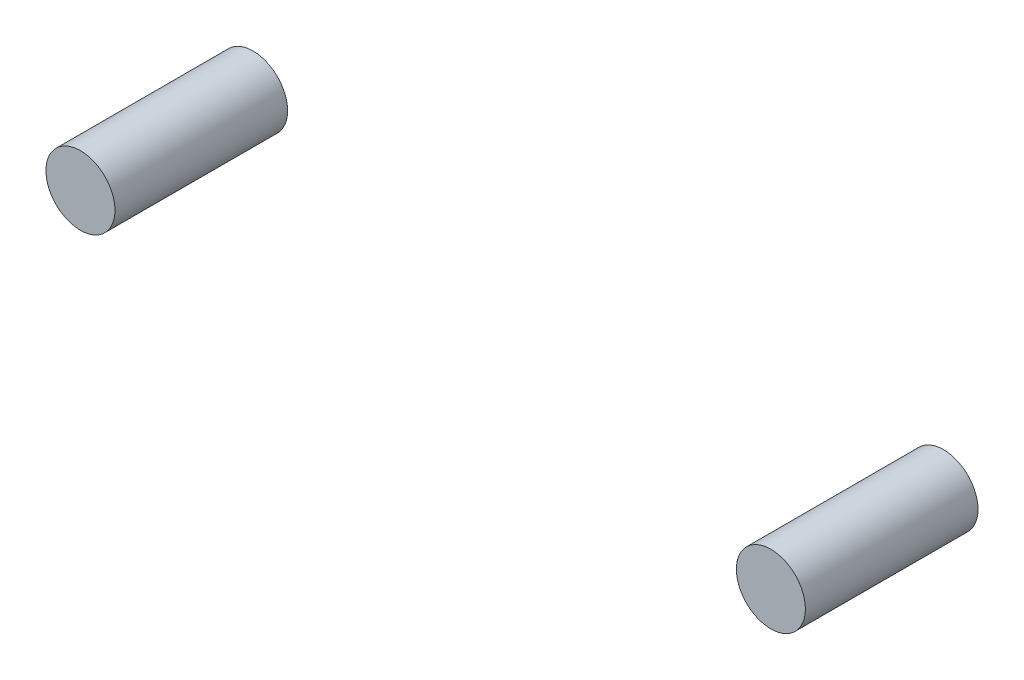
ISO-10303-21;
HEADER;
FILE_DESCRIPTION(('STEP AP214'),'2;1');
FILE_NAME('part.step','',(''),(''),'','','');
FILE_SCHEMA(('AUTOMOTIVE_DESIGN { 1 0 10303 214 1 1 1 1 }'));
ENDSEC;
DATA;
#1=APPLICATION_CONTEXT('core data for automotive mechanical design processes');
#2=APPLICATION_PROTOCOL_DEFINITION('international standard','automotive_design',2000,#1);
#3=PRODUCT_CONTEXT('',#1,'mechanical');
#4=PRODUCT('Part','Part','',(#3));
#5=PRODUCT_RELATED_PRODUCT_CATEGORY('part','',(#4));
#6=PRODUCT_DEFINITION_FORMATION('','',#4);
#7=PRODUCT_DEFINITION_CONTEXT('part definition',#1,'design');
#8=PRODUCT_DEFINITION('design','',#6,#7);
#9=PRODUCT_DEFINITION_SHAPE('','',#8);
#10=(LENGTH_UNIT() NAMED_UNIT(*) SI_UNIT(.MILLI.,.METRE.));
#11=(NAMED_UNIT(*) PLANE_ANGLE_UNIT() SI_UNIT($,.RADIAN.));
#12=(NAMED_UNIT(*) SI_UNIT($,.STERADIAN.) SOLID_ANGLE_UNIT());
#13=UNCERTAINTY_MEASURE_WITH_UNIT(LENGTH_MEASURE(1.E-05),#10,'distance_accuracy_value','');
#14=(GEOMETRIC_REPRESENTATION_CONTEXT(3) GLOBAL_UNCERTAINTY_ASSIGNED_CONTEXT((#13)) GLOBAL_UNIT_ASSIGNED_CONTEXT((#10,
#11,#12)) REPRESENTATION_CONTEXT('',''));
#15=CARTESIAN_POINT('',(0.,0.,0.));
#16=DIRECTION('',(0.,0.,1.));
#17=DIRECTION('',(1.,0.,0.));
#18=AXIS2_PLACEMENT_3D('',#15,#16,#17);
#19=CARTESIAN_POINT('',(11.138353765324,0.,5.));
#20=DIRECTION('',(0.,0.,-1.));
#21=DIRECTION('',(-1.,0.,0.));
#22=AXIS2_PLACEMENT_3D('',#19,#20,#21);
#23=CYLINDRICAL_SURFACE('',#22,1.);
#24=CARTESIAN_POINT('',(11.138353765324,0.,5.));
#25=DIRECTION('',(0.,0.,1.));
#26=DIRECTION('',(1.,0.,0.));
#27=AXIS2_PLACEMENT_3D('',#24,#25,#26);
#28=CIRCLE('',#27,1.);
#29=CARTESIAN_POINT('',(12.138353765324,0.,5.));
#30=VERTEX_POINT('',#29);
#31=EDGE_CURVE('E53',#30,#30,#28,.T.);
#32=ORIENTED_EDGE('',*,*,#31,.F.);
#33=EDGE_LOOP('',(#32));
#34=FACE_BOUND('',#33,.T.);
#35=CARTESIAN_POINT('',(11.138353765324,0.,0.));
#36=DIRECTION('',(0.,0.,1.));
#37=DIRECTION('',(1.,0.,0.));
#38=AXIS2_PLACEMENT_3D('',#35,#36,#37);
#39=CIRCLE('',#38,1.);
#40=CARTESIAN_POINT('',(12.138353765324,0.,0.));
#41=VERTEX_POINT('',#40);
#42=EDGE_CURVE('E11',#41,#41,#39,.T.);
#43=ORIENTED_EDGE('',*,*,#42,.T.);
#44=EDGE_LOOP('',(#43));
#45=FACE_BOUND('',#44,.T.);
#46=ADVANCED_FACE('F49',(#34,#45),#23,.T.);
#47=CARTESIAN_POINT('',(11.138353765324,0.,5.));
#48=DIRECTION('',(0.,0.,1.));
#49=DIRECTION('',(1.,0.,0.));
#50=AXIS2_PLACEMENT_3D('',#47,#48,#49);
#51=PLANE('',#50);
#52=ORIENTED_EDGE('',*,*,#31,.T.);
#53=EDGE_LOOP('',(#52));
#54=FACE_BOUND('',#53,.T.);
#55=ADVANCED_FACE('F51',(#54),#51,.T.);
#56=CARTESIAN_POINT('',(11.138353765324,0.,0.));
#57=DIRECTION('',(0.,0.,1.));
#58=DIRECTION('',(1.,0.,0.));
#59=AXIS2_PLACEMENT_3D('',#56,#57,#58);
#60=PLANE('',#59);
#61=ORIENTED_EDGE('',*,*,#42,.F.);
#62=EDGE_LOOP('',(#61));
#63=FACE_BOUND('',#62,.T.);
#64=ADVANCED_FACE('F70',(#63),#60,.F.);
#65=CLOSED_SHELL('',(#46,#55,#64));
#66=MANIFOLD_SOLID_BREP('B2',#65);
#67=CARTESIAN_POINT('',(-8.86164623467601,0.,5.));
#68=DIRECTION('',(0.,0.,-1.));
#69=DIRECTION('',(-1.,0.,0.));
#70=AXIS2_PLACEMENT_3D('',#67,#68,#69);
#71=CYLINDRICAL_SURFACE('',#70,1.);
#72=CARTESIAN_POINT('',(-8.86164623467601,0.,5.));
#73=DIRECTION('',(0.,0.,1.));
#74=DIRECTION('',(1.,0.,0.));
#75=AXIS2_PLACEMENT_3D('',#72,#73,#74);
#76=CIRCLE('',#75,1.);
#77=CARTESIAN_POINT('',(-7.86164623467601,0.,5.));
#78=VERTEX_POINT('',#77);
#79=EDGE_CURVE('E48',#78,#78,#76,.T.);
#80=ORIENTED_EDGE('',*,*,#79,.F.);
#81=EDGE_LOOP('',(#80));
#82=FACE_BOUND('',#81,.T.);
#83=CARTESIAN_POINT('',(-8.86164623467601,0.,0.));
#84=DIRECTION('',(0.,0.,1.));
#85=DIRECTION('',(1.,0.,0.));
#86=AXIS2_PLACEMENT_3D('',#83,#84,#85);
#87=CIRCLE('',#86,1.);
#88=CARTESIAN_POINT('',(-7.86164623467601,0.,0.));
#89=VERTEX_POINT('',#88);
#90=EDGE_CURVE('E101',#89,#89,#87,.T.);
#91=ORIENTED_EDGE('',*,*,#90,.T.);
#92=EDGE_LOOP('',(#91));
#93=FACE_BOUND('',#92,.T.);
#94=ADVANCED_FACE('F98',(#82,#93),#71,.T.);
#95=CARTESIAN_POINT('',(-8.86164623467601,0.,5.));
#96=DIRECTION('',(0.,0.,1.));
#97=DIRECTION('',(1.,0.,0.));
#98=AXIS2_PLACEMENT_3D('',#95,#96,#97);
#99=PLANE('',#98);
#100=ORIENTED_EDGE('',*,*,#79,.T.);
#101=EDGE_LOOP('',(#100));
#102=FACE_BOUND('',#101,.T.);
#103=ADVANCED_FACE('F113',(#102),#99,.T.);
#104=CARTESIAN_POINT('',(-8.86164623467601,0.,0.));
#105=DIRECTION('',(0.,0.,1.));
#106=DIRECTION('',(1.,0.,0.));
#107=AXIS2_PLACEMENT_3D('',#104,#105,#106);
#108=PLANE('',#107);
#109=ORIENTED_EDGE('',*,*,#90,.F.);
#110=EDGE_LOOP('',(#109));
#111=FACE_BOUND('',#110,.T.);
#112=ADVANCED_FACE('F111',(#111),#108,.F.);
#113=CLOSED_SHELL('',(#94,#103,#112));
#114=MANIFOLD_SOLID_BREP('B6',#113);
#115=ADVANCED_BREP_SHAPE_REPRESENTATION('',(#18,#66,#114),#14);
#116=SHAPE_DEFINITION_REPRESENTATION(#9,#115);
ENDSEC;
END-ISO-10303-21;
